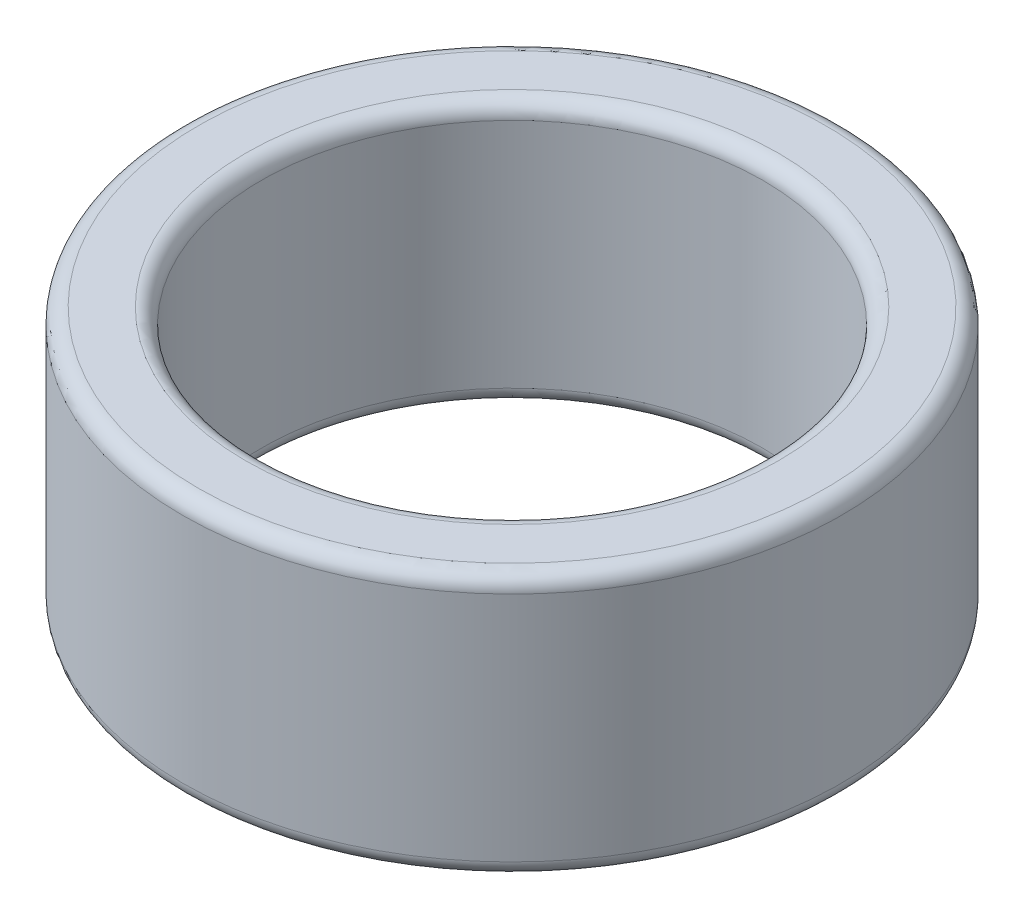
ISO-10303-21;
HEADER;
FILE_DESCRIPTION(('STEP AP214'),'2;1');
FILE_NAME('part.step','',(''),(''),'','','');
FILE_SCHEMA(('AUTOMOTIVE_DESIGN { 1 0 10303 214 1 1 1 1 }'));
ENDSEC;
DATA;
#1=APPLICATION_CONTEXT('core data for automotive mechanical design processes');
#2=APPLICATION_PROTOCOL_DEFINITION('international standard','automotive_design',2000,#1);
#3=PRODUCT_CONTEXT('',#1,'mechanical');
#4=PRODUCT('Part','Part','',(#3));
#5=PRODUCT_RELATED_PRODUCT_CATEGORY('part','',(#4));
#6=PRODUCT_DEFINITION_FORMATION('','',#4);
#7=PRODUCT_DEFINITION_CONTEXT('part definition',#1,'design');
#8=PRODUCT_DEFINITION('design','',#6,#7);
#9=PRODUCT_DEFINITION_SHAPE('','',#8);
#10=(LENGTH_UNIT() NAMED_UNIT(*) SI_UNIT(.MILLI.,.METRE.));
#11=(NAMED_UNIT(*) PLANE_ANGLE_UNIT() SI_UNIT($,.RADIAN.));
#12=(NAMED_UNIT(*) SI_UNIT($,.STERADIAN.) SOLID_ANGLE_UNIT());
#13=UNCERTAINTY_MEASURE_WITH_UNIT(LENGTH_MEASURE(1.E-05),#10,'distance_accuracy_value','');
#14=(GEOMETRIC_REPRESENTATION_CONTEXT(3) GLOBAL_UNCERTAINTY_ASSIGNED_CONTEXT((#13)) GLOBAL_UNIT_ASSIGNED_CONTEXT((#10,
#11,#12)) REPRESENTATION_CONTEXT('',''));
#15=CARTESIAN_POINT('',(0.,0.,0.));
#16=DIRECTION('',(0.,0.,1.));
#17=DIRECTION('',(1.,0.,0.));
#18=AXIS2_PLACEMENT_3D('',#15,#16,#17);
#19=CARTESIAN_POINT('',(0.,4.2,0.));
#20=DIRECTION('',(0.,1.,0.));
#21=DIRECTION('',(0.,0.,1.));
#22=AXIS2_PLACEMENT_3D('',#19,#20,#21);
#23=PLANE('',#22);
#24=CARTESIAN_POINT('',(0.,4.2,0.));
#25=DIRECTION('',(0.,1.,0.));
#26=DIRECTION('',(0.,0.,1.));
#27=AXIS2_PLACEMENT_3D('',#24,#25,#26);
#28=CIRCLE('',#27,5.0075);
#29=CARTESIAN_POINT('',(0.,4.2,5.0075));
#30=VERTEX_POINT('',#29);
#31=EDGE_CURVE('E73',#30,#30,#28,.T.);
#32=ORIENTED_EDGE('',*,*,#31,.T.);
#33=EDGE_LOOP('',(#32));
#34=FACE_BOUND('',#33,.T.);
#35=CARTESIAN_POINT('',(0.,4.2,0.));
#36=DIRECTION('',(0.,1.,0.));
#37=DIRECTION('',(0.,0.,1.));
#38=AXIS2_PLACEMENT_3D('',#35,#36,#37);
#39=CIRCLE('',#38,4.25);
#40=CARTESIAN_POINT('',(0.,4.2,4.25));
#41=VERTEX_POINT('',#40);
#42=EDGE_CURVE('E76',#41,#41,#39,.F.);
#43=ORIENTED_EDGE('',*,*,#42,.T.);
#44=EDGE_LOOP('',(#43));
#45=FACE_BOUND('',#44,.T.);
#46=ADVANCED_FACE('F47',(#34,#45),#23,.T.);
#47=CARTESIAN_POINT('',(0.,0.,0.));
#48=DIRECTION('',(0.,1.,0.));
#49=DIRECTION('',(0.,0.,1.));
#50=AXIS2_PLACEMENT_3D('',#47,#48,#49);
#51=PLANE('',#50);
#52=CARTESIAN_POINT('',(0.,0.,0.));
#53=DIRECTION('',(0.,1.,0.));
#54=DIRECTION('',(0.,0.,1.));
#55=AXIS2_PLACEMENT_3D('',#52,#53,#54);
#56=CIRCLE('',#55,5.0075);
#57=CARTESIAN_POINT('',(0.,0.,5.0075));
#58=VERTEX_POINT('',#57);
#59=EDGE_CURVE('E10',#58,#58,#56,.F.);
#60=ORIENTED_EDGE('',*,*,#59,.T.);
#61=EDGE_LOOP('',(#60));
#62=FACE_BOUND('',#61,.T.);
#63=CARTESIAN_POINT('',(0.,0.,0.));
#64=DIRECTION('',(0.,1.,0.));
#65=DIRECTION('',(0.,0.,1.));
#66=AXIS2_PLACEMENT_3D('',#63,#64,#65);
#67=CIRCLE('',#66,4.25);
#68=CARTESIAN_POINT('',(0.,0.,4.25));
#69=VERTEX_POINT('',#68);
#70=EDGE_CURVE('E54',#69,#69,#67,.T.);
#71=ORIENTED_EDGE('',*,*,#70,.T.);
#72=EDGE_LOOP('',(#71));
#73=FACE_BOUND('',#72,.T.);
#74=ADVANCED_FACE('F103',(#62,#73),#51,.F.);
#75=CARTESIAN_POINT('',(0.,4.2,0.));
#76=DIRECTION('',(0.,-1.,0.));
#77=DIRECTION('',(0.,0.,-1.));
#78=AXIS2_PLACEMENT_3D('',#75,#76,#77);
#79=CYLINDRICAL_SURFACE('',#78,5.2575);
#80=CARTESIAN_POINT('',(0.,3.95,0.));
#81=DIRECTION('',(0.,1.,0.));
#82=DIRECTION('',(0.,0.,1.));
#83=AXIS2_PLACEMENT_3D('',#80,#81,#82);
#84=CIRCLE('',#83,5.2575);
#85=CARTESIAN_POINT('',(0.,3.95,5.2575));
#86=VERTEX_POINT('',#85);
#87=EDGE_CURVE('E67',#86,#86,#84,.F.);
#88=ORIENTED_EDGE('',*,*,#87,.T.);
#89=EDGE_LOOP('',(#88));
#90=FACE_BOUND('',#89,.T.);
#91=CARTESIAN_POINT('',(0.,0.25,0.));
#92=DIRECTION('',(0.,1.,0.));
#93=DIRECTION('',(0.,0.,1.));
#94=AXIS2_PLACEMENT_3D('',#91,#92,#93);
#95=CIRCLE('',#94,5.2575);
#96=CARTESIAN_POINT('',(0.,0.25,5.2575));
#97=VERTEX_POINT('',#96);
#98=EDGE_CURVE('E70',#97,#97,#95,.T.);
#99=ORIENTED_EDGE('',*,*,#98,.T.);
#100=EDGE_LOOP('',(#99));
#101=FACE_BOUND('',#100,.T.);
#102=ADVANCED_FACE('F92',(#90,#101),#79,.T.);
#103=CARTESIAN_POINT('',(0.,4.2,0.));
#104=DIRECTION('',(0.,-1.,0.));
#105=DIRECTION('',(0.,0.,-1.));
#106=AXIS2_PLACEMENT_3D('',#103,#104,#105);
#107=CYLINDRICAL_SURFACE('',#106,4.);
#108=CARTESIAN_POINT('',(0.,3.95,0.));
#109=DIRECTION('',(0.,1.,0.));
#110=DIRECTION('',(0.,0.,1.));
#111=AXIS2_PLACEMENT_3D('',#108,#109,#110);
#112=CIRCLE('',#111,4.);
#113=CARTESIAN_POINT('',(0.,3.95,4.));
#114=VERTEX_POINT('',#113);
#115=EDGE_CURVE('E58',#114,#114,#112,.T.);
#116=ORIENTED_EDGE('',*,*,#115,.T.);
#117=EDGE_LOOP('',(#116));
#118=FACE_BOUND('',#117,.T.);
#119=CARTESIAN_POINT('',(0.,0.25,0.));
#120=DIRECTION('',(0.,1.,0.));
#121=DIRECTION('',(0.,0.,1.));
#122=AXIS2_PLACEMENT_3D('',#119,#120,#121);
#123=CIRCLE('',#122,4.);
#124=CARTESIAN_POINT('',(0.,0.25,4.));
#125=VERTEX_POINT('',#124);
#126=EDGE_CURVE('E62',#125,#125,#123,.F.);
#127=ORIENTED_EDGE('',*,*,#126,.T.);
#128=EDGE_LOOP('',(#127));
#129=FACE_BOUND('',#128,.T.);
#130=ADVANCED_FACE('F89',(#118,#129),#107,.F.);
#131=CARTESIAN_POINT('',(0.,3.95,0.));
#132=DIRECTION('',(0.,1.,0.));
#133=DIRECTION('',(0.,0.,1.));
#134=AXIS2_PLACEMENT_3D('',#131,#132,#133);
#135=TOROIDAL_SURFACE('',#134,5.0075,0.25);
#136=ORIENTED_EDGE('',*,*,#87,.F.);
#137=EDGE_LOOP('',(#136));
#138=FACE_BOUND('',#137,.T.);
#139=ORIENTED_EDGE('',*,*,#31,.F.);
#140=EDGE_LOOP('',(#139));
#141=FACE_BOUND('',#140,.T.);
#142=ADVANCED_FACE('F85',(#138,#141),#135,.T.);
#143=CARTESIAN_POINT('',(0.,3.95,0.));
#144=DIRECTION('',(0.,1.,0.));
#145=DIRECTION('',(0.,0.,1.));
#146=AXIS2_PLACEMENT_3D('',#143,#144,#145);
#147=TOROIDAL_SURFACE('',#146,4.25,0.25);
#148=ORIENTED_EDGE('',*,*,#42,.F.);
#149=EDGE_LOOP('',(#148));
#150=FACE_BOUND('',#149,.T.);
#151=ORIENTED_EDGE('',*,*,#115,.F.);
#152=EDGE_LOOP('',(#151));
#153=FACE_BOUND('',#152,.T.);
#154=ADVANCED_FACE('F81',(#150,#153),#147,.T.);
#155=CARTESIAN_POINT('',(0.,0.25,0.));
#156=DIRECTION('',(0.,1.,0.));
#157=DIRECTION('',(0.,0.,1.));
#158=AXIS2_PLACEMENT_3D('',#155,#156,#157);
#159=TOROIDAL_SURFACE('',#158,5.0075,0.25);
#160=ORIENTED_EDGE('',*,*,#59,.F.);
#161=EDGE_LOOP('',(#160));
#162=FACE_BOUND('',#161,.T.);
#163=ORIENTED_EDGE('',*,*,#98,.F.);
#164=EDGE_LOOP('',(#163));
#165=FACE_BOUND('',#164,.T.);
#166=ADVANCED_FACE('F84',(#162,#165),#159,.T.);
#167=CARTESIAN_POINT('',(0.,0.25,0.));
#168=DIRECTION('',(0.,1.,0.));
#169=DIRECTION('',(0.,0.,1.));
#170=AXIS2_PLACEMENT_3D('',#167,#168,#169);
#171=TOROIDAL_SURFACE('',#170,4.25,0.25);
#172=ORIENTED_EDGE('',*,*,#126,.F.);
#173=EDGE_LOOP('',(#172));
#174=FACE_BOUND('',#173,.T.);
#175=ORIENTED_EDGE('',*,*,#70,.F.);
#176=EDGE_LOOP('',(#175));
#177=FACE_BOUND('',#176,.T.);
#178=ADVANCED_FACE('F49',(#174,#177),#171,.T.);
#179=CLOSED_SHELL('',(#46,#74,#102,#130,#142,#154,#166,#178));
#180=MANIFOLD_SOLID_BREP('B2',#179);
#181=ADVANCED_BREP_SHAPE_REPRESENTATION('',(#18,#180),#14);
#182=SHAPE_DEFINITION_REPRESENTATION(#9,#181);
ENDSEC;
END-ISO-10303-21;
